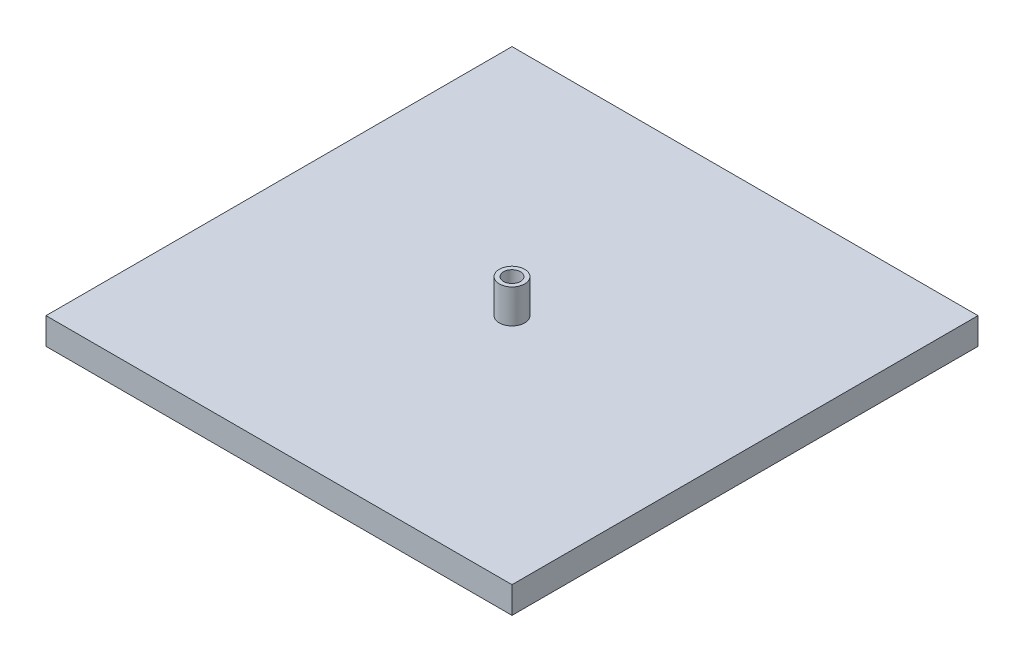
ISO-10303-21;
HEADER;
FILE_DESCRIPTION(('STEP AP214'),'2;1');
FILE_NAME('part.step','',(''),(''),'','','');
FILE_SCHEMA(('AUTOMOTIVE_DESIGN { 1 0 10303 214 1 1 1 1 }'));
ENDSEC;
DATA;
#1=APPLICATION_CONTEXT('core data for automotive mechanical design processes');
#2=APPLICATION_PROTOCOL_DEFINITION('international standard','automotive_design',2000,#1);
#3=PRODUCT_CONTEXT('',#1,'mechanical');
#4=PRODUCT('Part','Part','',(#3));
#5=PRODUCT_RELATED_PRODUCT_CATEGORY('part','',(#4));
#6=PRODUCT_DEFINITION_FORMATION('','',#4);
#7=PRODUCT_DEFINITION_CONTEXT('part definition',#1,'design');
#8=PRODUCT_DEFINITION('design','',#6,#7);
#9=PRODUCT_DEFINITION_SHAPE('','',#8);
#10=(LENGTH_UNIT() NAMED_UNIT(*) SI_UNIT(.MILLI.,.METRE.));
#11=(NAMED_UNIT(*) PLANE_ANGLE_UNIT() SI_UNIT($,.RADIAN.));
#12=(NAMED_UNIT(*) SI_UNIT($,.STERADIAN.) SOLID_ANGLE_UNIT());
#13=UNCERTAINTY_MEASURE_WITH_UNIT(LENGTH_MEASURE(1.E-05),#10,'distance_accuracy_value','');
#14=(GEOMETRIC_REPRESENTATION_CONTEXT(3) GLOBAL_UNCERTAINTY_ASSIGNED_CONTEXT((#13)) GLOBAL_UNIT_ASSIGNED_CONTEXT((#10,
#11,#12)) REPRESENTATION_CONTEXT('',''));
#15=CARTESIAN_POINT('',(0.,0.,0.));
#16=DIRECTION('',(0.,0.,1.));
#17=DIRECTION('',(1.,0.,0.));
#18=AXIS2_PLACEMENT_3D('',#15,#16,#17);
#19=CARTESIAN_POINT('',(0.,20.,0.));
#20=DIRECTION('',(0.,-1.,0.));
#21=DIRECTION('',(0.,0.,-1.));
#22=AXIS2_PLACEMENT_3D('',#19,#20,#21);
#23=PLANE('',#22);
#24=DIRECTION('',(0.,0.,1.));
#25=VECTOR('',#24,1.);
#26=CARTESIAN_POINT('',(0.,20.,0.));
#27=LINE('',#26,#25);
#28=CARTESIAN_POINT('',(0.,20.,-350.));
#29=VERTEX_POINT('',#28);
#30=CARTESIAN_POINT('',(0.,20.,0.));
#31=VERTEX_POINT('',#30);
#32=EDGE_CURVE('E93',#29,#31,#27,.T.);
#33=ORIENTED_EDGE('',*,*,#32,.T.);
#34=DIRECTION('',(1.,0.,0.));
#35=VECTOR('',#34,1.);
#36=CARTESIAN_POINT('',(0.,20.,0.));
#37=LINE('',#36,#35);
#38=CARTESIAN_POINT('',(350.,20.,0.));
#39=VERTEX_POINT('',#38);
#40=EDGE_CURVE('E88',#31,#39,#37,.T.);
#41=ORIENTED_EDGE('',*,*,#40,.T.);
#42=DIRECTION('',(0.,0.,-1.));
#43=VECTOR('',#42,1.);
#44=CARTESIAN_POINT('',(350.,20.,0.));
#45=LINE('',#44,#43);
#46=CARTESIAN_POINT('',(350.,20.,-350.));
#47=VERTEX_POINT('',#46);
#48=EDGE_CURVE('E91',#39,#47,#45,.T.);
#49=ORIENTED_EDGE('',*,*,#48,.T.);
#50=DIRECTION('',(-1.,0.,0.));
#51=VECTOR('',#50,1.);
#52=CARTESIAN_POINT('',(0.,20.,-350.));
#53=LINE('',#52,#51);
#54=EDGE_CURVE('E57',#47,#29,#53,.T.);
#55=ORIENTED_EDGE('',*,*,#54,.T.);
#56=EDGE_LOOP('',(#33,#41,#49,#55));
#57=FACE_BOUND('',#56,.T.);
#58=CARTESIAN_POINT('',(175.,20.,-175.));
#59=DIRECTION('',(0.,-1.,0.));
#60=DIRECTION('',(0.,0.,-1.));
#61=AXIS2_PLACEMENT_3D('',#58,#59,#60);
#62=CIRCLE('',#61,9.52499999999999);
#63=CARTESIAN_POINT('',(175.,20.,-184.525));
#64=VERTEX_POINT('',#63);
#65=EDGE_CURVE('E11',#64,#64,#62,.F.);
#66=ORIENTED_EDGE('',*,*,#65,.F.);
#67=EDGE_LOOP('',(#66));
#68=FACE_BOUND('',#67,.T.);
#69=ADVANCED_FACE('F39',(#57,#68),#23,.F.);
#70=CARTESIAN_POINT('',(0.,20.,0.));
#71=DIRECTION('',(1.,0.,0.));
#72=DIRECTION('',(0.,0.,-1.));
#73=AXIS2_PLACEMENT_3D('',#70,#71,#72);
#74=PLANE('',#73);
#75=DIRECTION('',(0.,0.,1.));
#76=VECTOR('',#75,1.);
#77=CARTESIAN_POINT('',(0.,0.,0.));
#78=LINE('',#77,#76);
#79=CARTESIAN_POINT('',(0.,0.,-350.));
#80=VERTEX_POINT('',#79);
#81=CARTESIAN_POINT('',(0.,0.,0.));
#82=VERTEX_POINT('',#81);
#83=EDGE_CURVE('E111',#80,#82,#78,.T.);
#84=ORIENTED_EDGE('',*,*,#83,.T.);
#85=DIRECTION('',(0.,-1.,0.));
#86=VECTOR('',#85,1.);
#87=CARTESIAN_POINT('',(0.,20.,0.));
#88=LINE('',#87,#86);
#89=EDGE_CURVE('E49',#31,#82,#88,.T.);
#90=ORIENTED_EDGE('',*,*,#89,.F.);
#91=ORIENTED_EDGE('',*,*,#32,.F.);
#92=DIRECTION('',(0.,-1.,0.));
#93=VECTOR('',#92,1.);
#94=CARTESIAN_POINT('',(0.,20.,-350.));
#95=LINE('',#94,#93);
#96=EDGE_CURVE('E107',#29,#80,#95,.T.);
#97=ORIENTED_EDGE('',*,*,#96,.T.);
#98=EDGE_LOOP('',(#84,#90,#91,#97));
#99=FACE_BOUND('',#98,.T.);
#100=ADVANCED_FACE('F41',(#99),#74,.F.);
#101=CARTESIAN_POINT('',(0.,20.,0.));
#102=DIRECTION('',(0.,0.,-1.));
#103=DIRECTION('',(-1.,0.,0.));
#104=AXIS2_PLACEMENT_3D('',#101,#102,#103);
#105=PLANE('',#104);
#106=DIRECTION('',(1.,0.,0.));
#107=VECTOR('',#106,1.);
#108=CARTESIAN_POINT('',(0.,0.,0.));
#109=LINE('',#108,#107);
#110=CARTESIAN_POINT('',(350.,0.,0.));
#111=VERTEX_POINT('',#110);
#112=EDGE_CURVE('E99',#82,#111,#109,.T.);
#113=ORIENTED_EDGE('',*,*,#112,.T.);
#114=DIRECTION('',(0.,-1.,0.));
#115=VECTOR('',#114,1.);
#116=CARTESIAN_POINT('',(350.,20.,0.));
#117=LINE('',#116,#115);
#118=EDGE_CURVE('E97',#39,#111,#117,.T.);
#119=ORIENTED_EDGE('',*,*,#118,.F.);
#120=ORIENTED_EDGE('',*,*,#40,.F.);
#121=ORIENTED_EDGE('',*,*,#89,.T.);
#122=EDGE_LOOP('',(#113,#119,#120,#121));
#123=FACE_BOUND('',#122,.T.);
#124=ADVANCED_FACE('F98',(#123),#105,.F.);
#125=CARTESIAN_POINT('',(350.,20.,0.));
#126=DIRECTION('',(-1.,0.,0.));
#127=DIRECTION('',(0.,0.,1.));
#128=AXIS2_PLACEMENT_3D('',#125,#126,#127);
#129=PLANE('',#128);
#130=DIRECTION('',(0.,0.,-1.));
#131=VECTOR('',#130,1.);
#132=CARTESIAN_POINT('',(350.,0.,0.));
#133=LINE('',#132,#131);
#134=CARTESIAN_POINT('',(350.,0.,-350.));
#135=VERTEX_POINT('',#134);
#136=EDGE_CURVE('E74',#111,#135,#133,.T.);
#137=ORIENTED_EDGE('',*,*,#136,.T.);
#138=DIRECTION('',(0.,-1.,0.));
#139=VECTOR('',#138,1.);
#140=CARTESIAN_POINT('',(350.,20.,-350.));
#141=LINE('',#140,#139);
#142=EDGE_CURVE('E101',#47,#135,#141,.T.);
#143=ORIENTED_EDGE('',*,*,#142,.F.);
#144=ORIENTED_EDGE('',*,*,#48,.F.);
#145=ORIENTED_EDGE('',*,*,#118,.T.);
#146=EDGE_LOOP('',(#137,#143,#144,#145));
#147=FACE_BOUND('',#146,.T.);
#148=ADVANCED_FACE('F103',(#147),#129,.F.);
#149=CARTESIAN_POINT('',(0.,20.,-350.));
#150=DIRECTION('',(0.,0.,1.));
#151=DIRECTION('',(1.,0.,0.));
#152=AXIS2_PLACEMENT_3D('',#149,#150,#151);
#153=PLANE('',#152);
#154=DIRECTION('',(-1.,0.,0.));
#155=VECTOR('',#154,1.);
#156=CARTESIAN_POINT('',(0.,0.,-350.));
#157=LINE('',#156,#155);
#158=EDGE_CURVE('E80',#135,#80,#157,.T.);
#159=ORIENTED_EDGE('',*,*,#158,.T.);
#160=ORIENTED_EDGE('',*,*,#96,.F.);
#161=ORIENTED_EDGE('',*,*,#54,.F.);
#162=ORIENTED_EDGE('',*,*,#142,.T.);
#163=EDGE_LOOP('',(#159,#160,#161,#162));
#164=FACE_BOUND('',#163,.T.);
#165=ADVANCED_FACE('F132',(#164),#153,.F.);
#166=CARTESIAN_POINT('',(0.,0.,0.));
#167=DIRECTION('',(0.,-1.,0.));
#168=DIRECTION('',(0.,0.,-1.));
#169=AXIS2_PLACEMENT_3D('',#166,#167,#168);
#170=PLANE('',#169);
#171=CARTESIAN_POINT('',(175.,0.,-175.));
#172=DIRECTION('',(0.,1.,0.));
#173=DIRECTION('',(0.,0.,1.));
#174=AXIS2_PLACEMENT_3D('',#171,#172,#173);
#175=CIRCLE('',#174,6.34999999999999);
#176=CARTESIAN_POINT('',(175.,0.,-168.65));
#177=VERTEX_POINT('',#176);
#178=EDGE_CURVE('E115',#177,#177,#175,.T.);
#179=ORIENTED_EDGE('',*,*,#178,.T.);
#180=EDGE_LOOP('',(#179));
#181=FACE_BOUND('',#180,.T.);
#182=ORIENTED_EDGE('',*,*,#83,.F.);
#183=ORIENTED_EDGE('',*,*,#158,.F.);
#184=ORIENTED_EDGE('',*,*,#136,.F.);
#185=ORIENTED_EDGE('',*,*,#112,.F.);
#186=EDGE_LOOP('',(#182,#183,#184,#185));
#187=FACE_BOUND('',#186,.T.);
#188=ADVANCED_FACE('F129',(#181,#187),#170,.T.);
#189=CARTESIAN_POINT('',(175.,0.,-175.));
#190=DIRECTION('',(0.,1.,0.));
#191=DIRECTION('',(0.,0.,1.));
#192=AXIS2_PLACEMENT_3D('',#189,#190,#191);
#193=CYLINDRICAL_SURFACE('',#192,6.34999999999999);
#194=ORIENTED_EDGE('',*,*,#178,.F.);
#195=EDGE_LOOP('',(#194));
#196=FACE_BOUND('',#195,.T.);
#197=CARTESIAN_POINT('',(175.,45.4,-175.));
#198=DIRECTION('',(0.,1.,0.));
#199=DIRECTION('',(0.,0.,1.));
#200=AXIS2_PLACEMENT_3D('',#197,#198,#199);
#201=CIRCLE('',#200,6.34999999999999);
#202=CARTESIAN_POINT('',(175.,45.4,-168.65));
#203=VERTEX_POINT('',#202);
#204=EDGE_CURVE('E164',#203,#203,#201,.T.);
#205=ORIENTED_EDGE('',*,*,#204,.T.);
#206=EDGE_LOOP('',(#205));
#207=FACE_BOUND('',#206,.T.);
#208=ADVANCED_FACE('F131',(#196,#207),#193,.F.);
#209=CARTESIAN_POINT('',(175.,45.4,-175.));
#210=DIRECTION('',(0.,1.,0.));
#211=DIRECTION('',(0.,0.,1.));
#212=AXIS2_PLACEMENT_3D('',#209,#210,#211);
#213=PLANE('',#212);
#214=CARTESIAN_POINT('',(175.,45.4,-175.));
#215=DIRECTION('',(0.,1.,0.));
#216=DIRECTION('',(0.,0.,1.));
#217=AXIS2_PLACEMENT_3D('',#214,#215,#216);
#218=CIRCLE('',#217,9.52499999999999);
#219=CARTESIAN_POINT('',(175.,45.4,-165.475));
#220=VERTEX_POINT('',#219);
#221=EDGE_CURVE('E161',#220,#220,#218,.T.);
#222=ORIENTED_EDGE('',*,*,#221,.T.);
#223=EDGE_LOOP('',(#222));
#224=FACE_BOUND('',#223,.T.);
#225=ORIENTED_EDGE('',*,*,#204,.F.);
#226=EDGE_LOOP('',(#225));
#227=FACE_BOUND('',#226,.T.);
#228=ADVANCED_FACE('F139',(#224,#227),#213,.T.);
#229=CARTESIAN_POINT('',(175.,45.4,-175.));
#230=DIRECTION('',(0.,-1.,0.));
#231=DIRECTION('',(0.,0.,-1.));
#232=AXIS2_PLACEMENT_3D('',#229,#230,#231);
#233=CYLINDRICAL_SURFACE('',#232,9.52499999999999);
#234=ORIENTED_EDGE('',*,*,#221,.F.);
#235=EDGE_LOOP('',(#234));
#236=FACE_BOUND('',#235,.T.);
#237=ORIENTED_EDGE('',*,*,#65,.T.);
#238=EDGE_LOOP('',(#237));
#239=FACE_BOUND('',#238,.T.);
#240=ADVANCED_FACE('F150',(#236,#239),#233,.T.);
#241=CLOSED_SHELL('',(#69,#100,#124,#148,#165,#188,#208,#228,#240));
#242=MANIFOLD_SOLID_BREP('B2',#241);
#243=ADVANCED_BREP_SHAPE_REPRESENTATION('',(#18,#242),#14);
#244=SHAPE_DEFINITION_REPRESENTATION(#9,#243);
ENDSEC;
END-ISO-10303-21;
